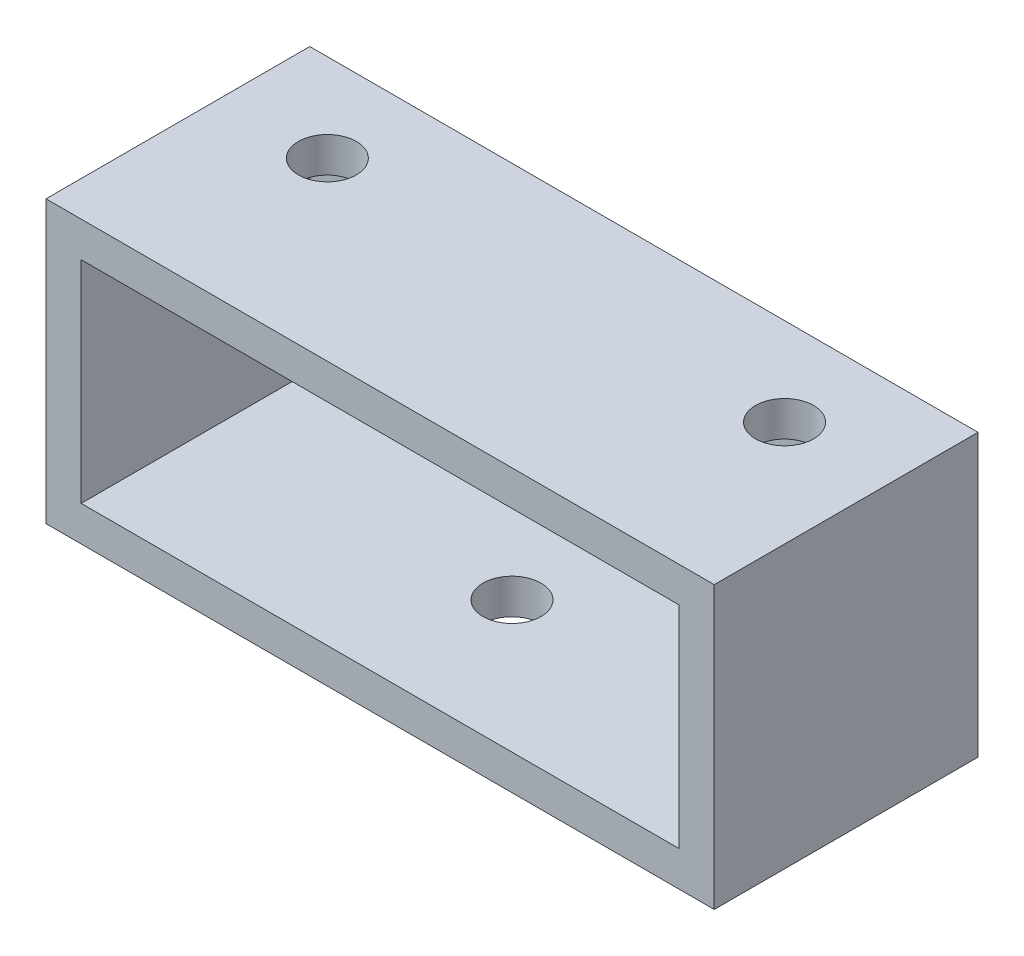
ISO-10303-21;
HEADER;
FILE_DESCRIPTION(('STEP AP214'),'2;1');
FILE_NAME('part.step','',(''),(''),'','','');
FILE_SCHEMA(('AUTOMOTIVE_DESIGN { 1 0 10303 214 1 1 1 1 }'));
ENDSEC;
DATA;
#1=APPLICATION_CONTEXT('core data for automotive mechanical design processes');
#2=APPLICATION_PROTOCOL_DEFINITION('international standard','automotive_design',2000,#1);
#3=PRODUCT_CONTEXT('',#1,'mechanical');
#4=PRODUCT('Part','Part','',(#3));
#5=PRODUCT_RELATED_PRODUCT_CATEGORY('part','',(#4));
#6=PRODUCT_DEFINITION_FORMATION('','',#4);
#7=PRODUCT_DEFINITION_CONTEXT('part definition',#1,'design');
#8=PRODUCT_DEFINITION('design','',#6,#7);
#9=PRODUCT_DEFINITION_SHAPE('','',#8);
#10=(LENGTH_UNIT() NAMED_UNIT(*) SI_UNIT(.MILLI.,.METRE.));
#11=(NAMED_UNIT(*) PLANE_ANGLE_UNIT() SI_UNIT($,.RADIAN.));
#12=(NAMED_UNIT(*) SI_UNIT($,.STERADIAN.) SOLID_ANGLE_UNIT());
#13=UNCERTAINTY_MEASURE_WITH_UNIT(LENGTH_MEASURE(1.E-05),#10,'distance_accuracy_value','');
#14=(GEOMETRIC_REPRESENTATION_CONTEXT(3) GLOBAL_UNCERTAINTY_ASSIGNED_CONTEXT((#13)) GLOBAL_UNIT_ASSIGNED_CONTEXT((#10,
#11,#12)) REPRESENTATION_CONTEXT('',''));
#15=CARTESIAN_POINT('',(0.,0.,0.));
#16=DIRECTION('',(0.,0.,1.));
#17=DIRECTION('',(1.,0.,0.));
#18=AXIS2_PLACEMENT_3D('',#15,#16,#17);
#19=CARTESIAN_POINT('',(0.,16.,0.));
#20=DIRECTION('',(1.,0.,0.));
#21=DIRECTION('',(0.,0.,-1.));
#22=AXIS2_PLACEMENT_3D('',#19,#20,#21);
#23=PLANE('',#22);
#24=DIRECTION('',(0.,0.,1.));
#25=VECTOR('',#24,1.);
#26=CARTESIAN_POINT('',(0.,0.,0.));
#27=LINE('',#26,#25);
#28=CARTESIAN_POINT('',(0.,0.,-15.));
#29=VERTEX_POINT('',#28);
#30=CARTESIAN_POINT('',(0.,0.,0.));
#31=VERTEX_POINT('',#30);
#32=EDGE_CURVE('E145',#29,#31,#27,.T.);
#33=ORIENTED_EDGE('',*,*,#32,.T.);
#34=DIRECTION('',(0.,-1.,0.));
#35=VECTOR('',#34,1.);
#36=CARTESIAN_POINT('',(0.,16.,0.));
#37=LINE('',#36,#35);
#38=CARTESIAN_POINT('',(0.,16.,0.));
#39=VERTEX_POINT('',#38);
#40=EDGE_CURVE('E12',#39,#31,#37,.T.);
#41=ORIENTED_EDGE('',*,*,#40,.F.);
#42=DIRECTION('',(0.,0.,1.));
#43=VECTOR('',#42,1.);
#44=CARTESIAN_POINT('',(0.,16.,0.));
#45=LINE('',#44,#43);
#46=CARTESIAN_POINT('',(0.,16.,-15.));
#47=VERTEX_POINT('',#46);
#48=EDGE_CURVE('E147',#47,#39,#45,.T.);
#49=ORIENTED_EDGE('',*,*,#48,.F.);
#50=DIRECTION('',(0.,-1.,0.));
#51=VECTOR('',#50,1.);
#52=CARTESIAN_POINT('',(0.,16.,-15.));
#53=LINE('',#52,#51);
#54=EDGE_CURVE('E153',#47,#29,#53,.T.);
#55=ORIENTED_EDGE('',*,*,#54,.T.);
#56=EDGE_LOOP('',(#33,#41,#49,#55));
#57=FACE_BOUND('',#56,.T.);
#58=ADVANCED_FACE('F39',(#57),#23,.F.);
#59=CARTESIAN_POINT('',(0.,16.,0.));
#60=DIRECTION('',(0.,0.,-1.));
#61=DIRECTION('',(-1.,0.,0.));
#62=AXIS2_PLACEMENT_3D('',#59,#60,#61);
#63=PLANE('',#62);
#64=DIRECTION('',(1.,0.,0.));
#65=VECTOR('',#64,1.);
#66=CARTESIAN_POINT('',(2.,2.,0.));
#67=LINE('',#66,#65);
#68=CARTESIAN_POINT('',(2.,2.,0.));
#69=VERTEX_POINT('',#68);
#70=CARTESIAN_POINT('',(36.,2.,0.));
#71=VERTEX_POINT('',#70);
#72=EDGE_CURVE('E128',#69,#71,#67,.T.);
#73=ORIENTED_EDGE('',*,*,#72,.F.);
#74=DIRECTION('',(0.,-1.,0.));
#75=VECTOR('',#74,1.);
#76=CARTESIAN_POINT('',(2.,14.,0.));
#77=LINE('',#76,#75);
#78=CARTESIAN_POINT('',(2.,14.,0.));
#79=VERTEX_POINT('',#78);
#80=EDGE_CURVE('E53',#79,#69,#77,.T.);
#81=ORIENTED_EDGE('',*,*,#80,.F.);
#82=DIRECTION('',(-1.,0.,0.));
#83=VECTOR('',#82,1.);
#84=CARTESIAN_POINT('',(36.,14.,0.));
#85=LINE('',#84,#83);
#86=CARTESIAN_POINT('',(36.,14.,0.));
#87=VERTEX_POINT('',#86);
#88=EDGE_CURVE('E134',#87,#79,#85,.T.);
#89=ORIENTED_EDGE('',*,*,#88,.F.);
#90=DIRECTION('',(0.,1.,0.));
#91=VECTOR('',#90,1.);
#92=CARTESIAN_POINT('',(36.,2.,0.));
#93=LINE('',#92,#91);
#94=EDGE_CURVE('E118',#71,#87,#93,.T.);
#95=ORIENTED_EDGE('',*,*,#94,.F.);
#96=EDGE_LOOP('',(#73,#81,#89,#95));
#97=FACE_BOUND('',#96,.T.);
#98=DIRECTION('',(1.,0.,0.));
#99=VECTOR('',#98,1.);
#100=CARTESIAN_POINT('',(0.,0.,0.));
#101=LINE('',#100,#99);
#102=CARTESIAN_POINT('',(38.,0.,0.));
#103=VERTEX_POINT('',#102);
#104=EDGE_CURVE('E156',#31,#103,#101,.T.);
#105=ORIENTED_EDGE('',*,*,#104,.T.);
#106=DIRECTION('',(0.,-1.,0.));
#107=VECTOR('',#106,1.);
#108=CARTESIAN_POINT('',(38.,16.,0.));
#109=LINE('',#108,#107);
#110=CARTESIAN_POINT('',(38.,16.,0.));
#111=VERTEX_POINT('',#110);
#112=EDGE_CURVE('E46',#111,#103,#109,.T.);
#113=ORIENTED_EDGE('',*,*,#112,.F.);
#114=DIRECTION('',(1.,0.,0.));
#115=VECTOR('',#114,1.);
#116=CARTESIAN_POINT('',(0.,16.,0.));
#117=LINE('',#116,#115);
#118=EDGE_CURVE('E90',#39,#111,#117,.T.);
#119=ORIENTED_EDGE('',*,*,#118,.F.);
#120=ORIENTED_EDGE('',*,*,#40,.T.);
#121=EDGE_LOOP('',(#105,#113,#119,#120));
#122=FACE_BOUND('',#121,.T.);
#123=ADVANCED_FACE('F132',(#97,#122),#63,.F.);
#124=CARTESIAN_POINT('',(38.,16.,0.));
#125=DIRECTION('',(-1.,0.,0.));
#126=DIRECTION('',(0.,0.,1.));
#127=AXIS2_PLACEMENT_3D('',#124,#125,#126);
#128=PLANE('',#127);
#129=DIRECTION('',(0.,0.,-1.));
#130=VECTOR('',#129,1.);
#131=CARTESIAN_POINT('',(38.,0.,0.));
#132=LINE('',#131,#130);
#133=CARTESIAN_POINT('',(38.,0.,-15.));
#134=VERTEX_POINT('',#133);
#135=EDGE_CURVE('E158',#103,#134,#132,.T.);
#136=ORIENTED_EDGE('',*,*,#135,.T.);
#137=DIRECTION('',(0.,-1.,0.));
#138=VECTOR('',#137,1.);
#139=CARTESIAN_POINT('',(38.,16.,-15.));
#140=LINE('',#139,#138);
#141=CARTESIAN_POINT('',(38.,16.,-15.));
#142=VERTEX_POINT('',#141);
#143=EDGE_CURVE('E162',#142,#134,#140,.T.);
#144=ORIENTED_EDGE('',*,*,#143,.F.);
#145=DIRECTION('',(0.,0.,-1.));
#146=VECTOR('',#145,1.);
#147=CARTESIAN_POINT('',(38.,16.,0.));
#148=LINE('',#147,#146);
#149=EDGE_CURVE('E150',#111,#142,#148,.T.);
#150=ORIENTED_EDGE('',*,*,#149,.F.);
#151=ORIENTED_EDGE('',*,*,#112,.T.);
#152=EDGE_LOOP('',(#136,#144,#150,#151));
#153=FACE_BOUND('',#152,.T.);
#154=ADVANCED_FACE('F167',(#153),#128,.F.);
#155=CARTESIAN_POINT('',(0.,16.,-15.));
#156=DIRECTION('',(0.,0.,1.));
#157=DIRECTION('',(1.,0.,0.));
#158=AXIS2_PLACEMENT_3D('',#155,#156,#157);
#159=PLANE('',#158);
#160=DIRECTION('',(-1.,0.,0.));
#161=VECTOR('',#160,1.);
#162=CARTESIAN_POINT('',(0.,0.,-15.));
#163=LINE('',#162,#161);
#164=EDGE_CURVE('E83',#134,#29,#163,.T.);
#165=ORIENTED_EDGE('',*,*,#164,.T.);
#166=ORIENTED_EDGE('',*,*,#54,.F.);
#167=DIRECTION('',(-1.,0.,0.));
#168=VECTOR('',#167,1.);
#169=CARTESIAN_POINT('',(0.,16.,-15.));
#170=LINE('',#169,#168);
#171=EDGE_CURVE('E62',#142,#47,#170,.T.);
#172=ORIENTED_EDGE('',*,*,#171,.F.);
#173=ORIENTED_EDGE('',*,*,#143,.T.);
#174=EDGE_LOOP('',(#165,#166,#172,#173));
#175=FACE_BOUND('',#174,.T.);
#176=ADVANCED_FACE('F175',(#175),#159,.F.);
#177=CARTESIAN_POINT('',(0.,16.,0.));
#178=DIRECTION('',(0.,-1.,0.));
#179=DIRECTION('',(0.,0.,-1.));
#180=AXIS2_PLACEMENT_3D('',#177,#178,#179);
#181=PLANE('',#180);
#182=CARTESIAN_POINT('',(6.,16.,-9.99999999999999));
#183=DIRECTION('',(0.,1.,0.));
#184=DIRECTION('',(0.,0.,1.));
#185=AXIS2_PLACEMENT_3D('',#182,#183,#184);
#186=CIRCLE('',#185,1.65);
#187=CARTESIAN_POINT('',(6.,16.,-8.34999999999999));
#188=VERTEX_POINT('',#187);
#189=EDGE_CURVE('E321',#188,#188,#186,.T.);
#190=ORIENTED_EDGE('',*,*,#189,.F.);
#191=EDGE_LOOP('',(#190));
#192=FACE_BOUND('',#191,.T.);
#193=CARTESIAN_POINT('',(32.,16.,-10.));
#194=DIRECTION('',(0.,1.,0.));
#195=DIRECTION('',(0.,0.,-1.));
#196=AXIS2_PLACEMENT_3D('',#193,#194,#195);
#197=CIRCLE('',#196,1.65);
#198=CARTESIAN_POINT('',(32.,16.,-11.65));
#199=VERTEX_POINT('',#198);
#200=EDGE_CURVE('E317',#199,#199,#197,.T.);
#201=ORIENTED_EDGE('',*,*,#200,.F.);
#202=EDGE_LOOP('',(#201));
#203=FACE_BOUND('',#202,.T.);
#204=ORIENTED_EDGE('',*,*,#48,.T.);
#205=ORIENTED_EDGE('',*,*,#118,.T.);
#206=ORIENTED_EDGE('',*,*,#149,.T.);
#207=ORIENTED_EDGE('',*,*,#171,.T.);
#208=EDGE_LOOP('',(#204,#205,#206,#207));
#209=FACE_BOUND('',#208,.T.);
#210=ADVANCED_FACE('F177',(#192,#203,#209),#181,.F.);
#211=CARTESIAN_POINT('',(0.,0.,0.));
#212=DIRECTION('',(0.,-1.,0.));
#213=DIRECTION('',(0.,0.,-1.));
#214=AXIS2_PLACEMENT_3D('',#211,#212,#213);
#215=PLANE('',#214);
#216=CARTESIAN_POINT('',(19.,0.,-7.5));
#217=DIRECTION('',(0.,-1.,0.));
#218=DIRECTION('',(0.,0.,-1.));
#219=AXIS2_PLACEMENT_3D('',#216,#217,#218);
#220=CIRCLE('',#219,1.65);
#221=CARTESIAN_POINT('',(19.,0.,-9.15));
#222=VERTEX_POINT('',#221);
#223=EDGE_CURVE('E304',#222,#222,#220,.T.);
#224=ORIENTED_EDGE('',*,*,#223,.F.);
#225=EDGE_LOOP('',(#224));
#226=FACE_BOUND('',#225,.T.);
#227=CARTESIAN_POINT('',(32.,0.,-7.5));
#228=DIRECTION('',(0.,-1.,0.));
#229=DIRECTION('',(0.,0.,-1.));
#230=AXIS2_PLACEMENT_3D('',#227,#228,#229);
#231=CIRCLE('',#230,1.65);
#232=CARTESIAN_POINT('',(32.,0.,-9.15));
#233=VERTEX_POINT('',#232);
#234=EDGE_CURVE('E308',#233,#233,#231,.T.);
#235=ORIENTED_EDGE('',*,*,#234,.F.);
#236=EDGE_LOOP('',(#235));
#237=FACE_BOUND('',#236,.T.);
#238=ORIENTED_EDGE('',*,*,#32,.F.);
#239=ORIENTED_EDGE('',*,*,#164,.F.);
#240=ORIENTED_EDGE('',*,*,#135,.F.);
#241=ORIENTED_EDGE('',*,*,#104,.F.);
#242=EDGE_LOOP('',(#238,#239,#240,#241));
#243=FACE_BOUND('',#242,.T.);
#244=ADVANCED_FACE('F171',(#226,#237,#243),#215,.T.);
#245=CARTESIAN_POINT('',(2.,14.,-51.0555127546399));
#246=DIRECTION('',(-1.,0.,0.));
#247=DIRECTION('',(0.,0.,1.));
#248=AXIS2_PLACEMENT_3D('',#245,#246,#247);
#249=PLANE('',#248);
#250=DIRECTION('',(0.,1.,0.));
#251=VECTOR('',#250,1.);
#252=CARTESIAN_POINT('',(2.,14.,-13.));
#253=LINE('',#252,#251);
#254=CARTESIAN_POINT('',(2.,2.,-13.));
#255=VERTEX_POINT('',#254);
#256=CARTESIAN_POINT('',(2.,14.,-13.));
#257=VERTEX_POINT('',#256);
#258=EDGE_CURVE('E146',#255,#257,#253,.T.);
#259=ORIENTED_EDGE('',*,*,#258,.T.);
#260=DIRECTION('',(0.,0.,1.));
#261=VECTOR('',#260,1.);
#262=CARTESIAN_POINT('',(2.,14.,-51.0555127546399));
#263=LINE('',#262,#261);
#264=EDGE_CURVE('E139',#257,#79,#263,.T.);
#265=ORIENTED_EDGE('',*,*,#264,.T.);
#266=ORIENTED_EDGE('',*,*,#80,.T.);
#267=DIRECTION('',(0.,0.,1.));
#268=VECTOR('',#267,1.);
#269=CARTESIAN_POINT('',(2.,2.,-51.0555127546399));
#270=LINE('',#269,#268);
#271=EDGE_CURVE('E125',#255,#69,#270,.T.);
#272=ORIENTED_EDGE('',*,*,#271,.F.);
#273=EDGE_LOOP('',(#259,#265,#266,#272));
#274=FACE_BOUND('',#273,.T.);
#275=ADVANCED_FACE('F221',(#274),#249,.F.);
#276=CARTESIAN_POINT('',(36.,14.,-51.0555127546399));
#277=DIRECTION('',(0.,1.,0.));
#278=DIRECTION('',(0.,0.,1.));
#279=AXIS2_PLACEMENT_3D('',#276,#277,#278);
#280=PLANE('',#279);
#281=CARTESIAN_POINT('',(6.,14.,-9.99999999999999));
#282=DIRECTION('',(0.,1.,0.));
#283=DIRECTION('',(0.,0.,1.));
#284=AXIS2_PLACEMENT_3D('',#281,#282,#283);
#285=CIRCLE('',#284,1.65);
#286=CARTESIAN_POINT('',(6.,14.,-8.34999999999999));
#287=VERTEX_POINT('',#286);
#288=EDGE_CURVE('E318',#287,#287,#285,.T.);
#289=ORIENTED_EDGE('',*,*,#288,.T.);
#290=EDGE_LOOP('',(#289));
#291=FACE_BOUND('',#290,.T.);
#292=CARTESIAN_POINT('',(32.,14.,-10.));
#293=DIRECTION('',(0.,1.,0.));
#294=DIRECTION('',(0.,0.,-1.));
#295=AXIS2_PLACEMENT_3D('',#292,#293,#294);
#296=CIRCLE('',#295,1.65);
#297=CARTESIAN_POINT('',(32.,14.,-11.65));
#298=VERTEX_POINT('',#297);
#299=EDGE_CURVE('E324',#298,#298,#296,.T.);
#300=ORIENTED_EDGE('',*,*,#299,.T.);
#301=EDGE_LOOP('',(#300));
#302=FACE_BOUND('',#301,.T.);
#303=DIRECTION('',(1.,0.,0.));
#304=VECTOR('',#303,1.);
#305=CARTESIAN_POINT('',(36.,14.,-13.));
#306=LINE('',#305,#304);
#307=CARTESIAN_POINT('',(36.,14.,-13.));
#308=VERTEX_POINT('',#307);
#309=EDGE_CURVE('E330',#257,#308,#306,.T.);
#310=ORIENTED_EDGE('',*,*,#309,.T.);
#311=DIRECTION('',(0.,0.,1.));
#312=VECTOR('',#311,1.);
#313=CARTESIAN_POINT('',(36.,14.,-51.0555127546399));
#314=LINE('',#313,#312);
#315=EDGE_CURVE('E124',#308,#87,#314,.T.);
#316=ORIENTED_EDGE('',*,*,#315,.T.);
#317=ORIENTED_EDGE('',*,*,#88,.T.);
#318=ORIENTED_EDGE('',*,*,#264,.F.);
#319=EDGE_LOOP('',(#310,#316,#317,#318));
#320=FACE_BOUND('',#319,.T.);
#321=ADVANCED_FACE('F228',(#291,#302,#320),#280,.F.);
#322=CARTESIAN_POINT('',(36.,2.,-51.0555127546399));
#323=DIRECTION('',(1.,0.,0.));
#324=DIRECTION('',(0.,0.,-1.));
#325=AXIS2_PLACEMENT_3D('',#322,#323,#324);
#326=PLANE('',#325);
#327=DIRECTION('',(0.,-1.,0.));
#328=VECTOR('',#327,1.);
#329=CARTESIAN_POINT('',(36.,2.,-13.));
#330=LINE('',#329,#328);
#331=CARTESIAN_POINT('',(36.,2.,-13.));
#332=VERTEX_POINT('',#331);
#333=EDGE_CURVE('E121',#308,#332,#330,.T.);
#334=ORIENTED_EDGE('',*,*,#333,.T.);
#335=DIRECTION('',(0.,0.,1.));
#336=VECTOR('',#335,1.);
#337=CARTESIAN_POINT('',(36.,2.,-51.0555127546399));
#338=LINE('',#337,#336);
#339=EDGE_CURVE('E113',#332,#71,#338,.T.);
#340=ORIENTED_EDGE('',*,*,#339,.T.);
#341=ORIENTED_EDGE('',*,*,#94,.T.);
#342=ORIENTED_EDGE('',*,*,#315,.F.);
#343=EDGE_LOOP('',(#334,#340,#341,#342));
#344=FACE_BOUND('',#343,.T.);
#345=ADVANCED_FACE('F115',(#344),#326,.F.);
#346=CARTESIAN_POINT('',(2.,2.,-51.0555127546399));
#347=DIRECTION('',(0.,-1.,0.));
#348=DIRECTION('',(0.,0.,-1.));
#349=AXIS2_PLACEMENT_3D('',#346,#347,#348);
#350=PLANE('',#349);
#351=CARTESIAN_POINT('',(19.,2.,-7.5));
#352=DIRECTION('',(0.,1.,0.));
#353=DIRECTION('',(0.,0.,1.));
#354=AXIS2_PLACEMENT_3D('',#351,#352,#353);
#355=CIRCLE('',#354,1.65);
#356=CARTESIAN_POINT('',(19.,2.,-5.85));
#357=VERTEX_POINT('',#356);
#358=EDGE_CURVE('E307',#357,#357,#355,.T.);
#359=ORIENTED_EDGE('',*,*,#358,.F.);
#360=EDGE_LOOP('',(#359));
#361=FACE_BOUND('',#360,.T.);
#362=CARTESIAN_POINT('',(32.,2.,-7.5));
#363=DIRECTION('',(0.,1.,0.));
#364=DIRECTION('',(0.,0.,1.));
#365=AXIS2_PLACEMENT_3D('',#362,#363,#364);
#366=CIRCLE('',#365,1.65);
#367=CARTESIAN_POINT('',(32.,2.,-5.85));
#368=VERTEX_POINT('',#367);
#369=EDGE_CURVE('E309',#368,#368,#366,.T.);
#370=ORIENTED_EDGE('',*,*,#369,.F.);
#371=EDGE_LOOP('',(#370));
#372=FACE_BOUND('',#371,.T.);
#373=DIRECTION('',(-1.,0.,0.));
#374=VECTOR('',#373,1.);
#375=CARTESIAN_POINT('',(2.,2.,-13.));
#376=LINE('',#375,#374);
#377=EDGE_CURVE('E143',#332,#255,#376,.T.);
#378=ORIENTED_EDGE('',*,*,#377,.T.);
#379=ORIENTED_EDGE('',*,*,#271,.T.);
#380=ORIENTED_EDGE('',*,*,#72,.T.);
#381=ORIENTED_EDGE('',*,*,#339,.F.);
#382=EDGE_LOOP('',(#378,#379,#380,#381));
#383=FACE_BOUND('',#382,.T.);
#384=ADVANCED_FACE('F129',(#361,#372,#383),#350,.F.);
#385=CARTESIAN_POINT('',(0.,16.,-13.));
#386=DIRECTION('',(0.,0.,1.));
#387=DIRECTION('',(1.,0.,0.));
#388=AXIS2_PLACEMENT_3D('',#385,#386,#387);
#389=PLANE('',#388);
#390=ORIENTED_EDGE('',*,*,#258,.F.);
#391=ORIENTED_EDGE('',*,*,#377,.F.);
#392=ORIENTED_EDGE('',*,*,#333,.F.);
#393=ORIENTED_EDGE('',*,*,#309,.F.);
#394=EDGE_LOOP('',(#390,#391,#392,#393));
#395=FACE_BOUND('',#394,.T.);
#396=ADVANCED_FACE('F251',(#395),#389,.T.);
#397=CARTESIAN_POINT('',(32.,14.,-10.));
#398=DIRECTION('',(0.,1.,0.));
#399=DIRECTION('',(0.,0.,1.));
#400=AXIS2_PLACEMENT_3D('',#397,#398,#399);
#401=CYLINDRICAL_SURFACE('',#400,1.65);
#402=ORIENTED_EDGE('',*,*,#299,.F.);
#403=EDGE_LOOP('',(#402));
#404=FACE_BOUND('',#403,.T.);
#405=ORIENTED_EDGE('',*,*,#200,.T.);
#406=EDGE_LOOP('',(#405));
#407=FACE_BOUND('',#406,.T.);
#408=ADVANCED_FACE('F259',(#404,#407),#401,.F.);
#409=CARTESIAN_POINT('',(6.,14.,-9.99999999999999));
#410=DIRECTION('',(0.,1.,0.));
#411=DIRECTION('',(0.,0.,1.));
#412=AXIS2_PLACEMENT_3D('',#409,#410,#411);
#413=CYLINDRICAL_SURFACE('',#412,1.65);
#414=ORIENTED_EDGE('',*,*,#288,.F.);
#415=EDGE_LOOP('',(#414));
#416=FACE_BOUND('',#415,.T.);
#417=ORIENTED_EDGE('',*,*,#189,.T.);
#418=EDGE_LOOP('',(#417));
#419=FACE_BOUND('',#418,.T.);
#420=ADVANCED_FACE('F267',(#416,#419),#413,.F.);
#421=CARTESIAN_POINT('',(32.,-8.,-7.5));
#422=DIRECTION('',(0.,1.,0.));
#423=DIRECTION('',(0.,0.,1.));
#424=AXIS2_PLACEMENT_3D('',#421,#422,#423);
#425=CYLINDRICAL_SURFACE('',#424,1.65);
#426=ORIENTED_EDGE('',*,*,#234,.T.);
#427=EDGE_LOOP('',(#426));
#428=FACE_BOUND('',#427,.T.);
#429=ORIENTED_EDGE('',*,*,#369,.T.);
#430=EDGE_LOOP('',(#429));
#431=FACE_BOUND('',#430,.T.);
#432=ADVANCED_FACE('F276',(#428,#431),#425,.F.);
#433=CARTESIAN_POINT('',(19.,-8.,-7.5));
#434=DIRECTION('',(0.,1.,0.));
#435=DIRECTION('',(0.,0.,1.));
#436=AXIS2_PLACEMENT_3D('',#433,#434,#435);
#437=CYLINDRICAL_SURFACE('',#436,1.65);
#438=ORIENTED_EDGE('',*,*,#223,.T.);
#439=EDGE_LOOP('',(#438));
#440=FACE_BOUND('',#439,.T.);
#441=ORIENTED_EDGE('',*,*,#358,.T.);
#442=EDGE_LOOP('',(#441));
#443=FACE_BOUND('',#442,.T.);
#444=ADVANCED_FACE('F285',(#440,#443),#437,.F.);
#445=CLOSED_SHELL('',(#58,#123,#154,#176,#210,#244,#275,#321,#345,#384,#396,#408,#420,#432,#444));
#446=MANIFOLD_SOLID_BREP('B2',#445);
#447=ADVANCED_BREP_SHAPE_REPRESENTATION('',(#18,#446),#14);
#448=SHAPE_DEFINITION_REPRESENTATION(#9,#447);
ENDSEC;
END-ISO-10303-21;
